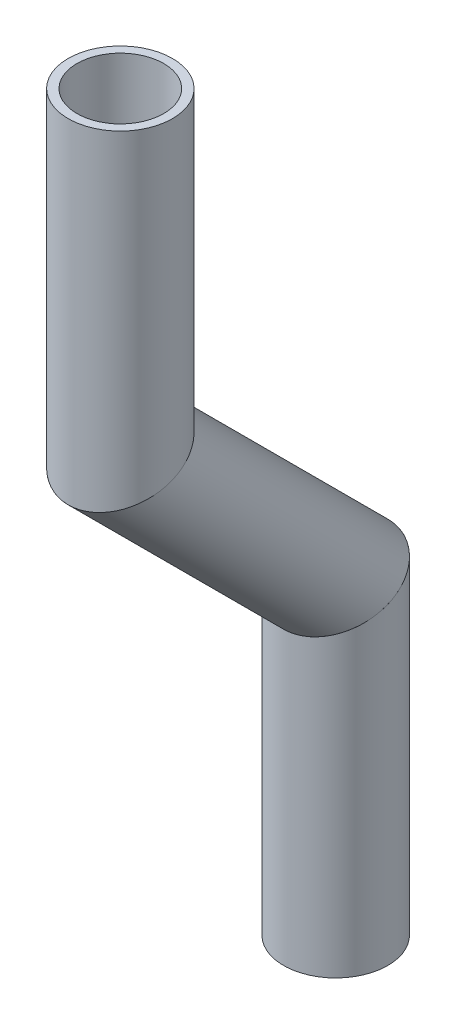
ISO-10303-21;
HEADER;
FILE_DESCRIPTION(('STEP AP214'),'2;1');
FILE_NAME('part.step','',(''),(''),'','','');
FILE_SCHEMA(('AUTOMOTIVE_DESIGN { 1 0 10303 214 1 1 1 1 }'));
ENDSEC;
DATA;
#1=APPLICATION_CONTEXT('core data for automotive mechanical design processes');
#2=APPLICATION_PROTOCOL_DEFINITION('international standard','automotive_design',2000,#1);
#3=PRODUCT_CONTEXT('',#1,'mechanical');
#4=PRODUCT('Part','Part','',(#3));
#5=PRODUCT_RELATED_PRODUCT_CATEGORY('part','',(#4));
#6=PRODUCT_DEFINITION_FORMATION('','',#4);
#7=PRODUCT_DEFINITION_CONTEXT('part definition',#1,'design');
#8=PRODUCT_DEFINITION('design','',#6,#7);
#9=PRODUCT_DEFINITION_SHAPE('','',#8);
#10=(LENGTH_UNIT() NAMED_UNIT(*) SI_UNIT(.MILLI.,.METRE.));
#11=(NAMED_UNIT(*) PLANE_ANGLE_UNIT() SI_UNIT($,.RADIAN.));
#12=(NAMED_UNIT(*) SI_UNIT($,.STERADIAN.) SOLID_ANGLE_UNIT());
#13=UNCERTAINTY_MEASURE_WITH_UNIT(LENGTH_MEASURE(1.E-05),#10,'distance_accuracy_value','');
#14=(GEOMETRIC_REPRESENTATION_CONTEXT(3) GLOBAL_UNCERTAINTY_ASSIGNED_CONTEXT((#13)) GLOBAL_UNIT_ASSIGNED_CONTEXT((#10,
#11,#12)) REPRESENTATION_CONTEXT('',''));
#15=CARTESIAN_POINT('',(0.,0.,0.));
#16=DIRECTION('',(0.,0.,1.));
#17=DIRECTION('',(1.,0.,0.));
#18=AXIS2_PLACEMENT_3D('',#15,#16,#17);
#19=CARTESIAN_POINT('',(0.,-248.701594492154,300.531279363213));
#20=DIRECTION('',(0.,1.,0.));
#21=DIRECTION('',(0.,0.,1.));
#22=AXIS2_PLACEMENT_3D('',#19,#20,#21);
#23=CYLINDRICAL_SURFACE('',#22,5.28319999999999);
#24=CARTESIAN_POINT('',(0.,-210.601594492154,300.531279363213));
#25=DIRECTION('',(0.,-1.,0.));
#26=DIRECTION('',(0.,0.,-1.));
#27=AXIS2_PLACEMENT_3D('',#24,#25,#26);
#28=CIRCLE('',#27,5.28319999999999);
#29=CARTESIAN_POINT('',(0.,-210.601594492154,295.248079363213));
#30=VERTEX_POINT('',#29);
#31=EDGE_CURVE('E55',#30,#30,#28,.T.);
#32=ORIENTED_EDGE('',*,*,#31,.F.);
#33=EDGE_LOOP('',(#32));
#34=FACE_BOUND('',#33,.T.);
#35=CARTESIAN_POINT('',(0.,-248.701594492154,300.531279363213));
#36=DIRECTION('',(0.,-0.923879532511285,-0.382683432365094));
#37=DIRECTION('',(0.,0.382683432365094,-0.923879532511285));
#38=AXIS2_PLACEMENT_3D('',#35,#36,#37);
#39=ELLIPSE('',#38,5.71849447258477,5.28319999999999);
#40=CARTESIAN_POINT('',(0.,-246.513221399424,295.248079363213));
#41=VERTEX_POINT('',#40);
#42=EDGE_CURVE('E51',#41,#41,#39,.T.);
#43=ORIENTED_EDGE('',*,*,#42,.T.);
#44=EDGE_LOOP('',(#43));
#45=FACE_BOUND('',#44,.T.);
#46=ADVANCED_FACE('F47',(#34,#45),#23,.F.);
#47=CARTESIAN_POINT('',(0.,-248.701594492154,300.531279363213));
#48=DIRECTION('',(0.,1.,0.));
#49=DIRECTION('',(0.,0.,1.));
#50=AXIS2_PLACEMENT_3D('',#47,#48,#49);
#51=CYLINDRICAL_SURFACE('',#50,6.35);
#52=CARTESIAN_POINT('',(0.,-210.601594492154,300.531279363213));
#53=DIRECTION('',(0.,-1.,0.));
#54=DIRECTION('',(0.,0.,-1.));
#55=AXIS2_PLACEMENT_3D('',#52,#53,#54);
#56=CIRCLE('',#55,6.35);
#57=CARTESIAN_POINT('',(0.,-210.601594492154,294.181279363213));
#58=VERTEX_POINT('',#57);
#59=EDGE_CURVE('E59',#58,#58,#56,.T.);
#60=ORIENTED_EDGE('',*,*,#59,.T.);
#61=EDGE_LOOP('',(#60));
#62=FACE_BOUND('',#61,.T.);
#63=CARTESIAN_POINT('',(0.,-248.701594492154,300.531279363213));
#64=DIRECTION('',(0.,-0.923879532511285,-0.382683432365094));
#65=DIRECTION('',(0.,0.382683432365094,-0.923879532511285));
#66=AXIS2_PLACEMENT_3D('',#63,#64,#65);
#67=ELLIPSE('',#66,6.87319047185671,6.35);
#68=CARTESIAN_POINT('',(0.,-246.071338371085,294.181279363213));
#69=VERTEX_POINT('',#68);
#70=EDGE_CURVE('E12',#69,#69,#67,.T.);
#71=ORIENTED_EDGE('',*,*,#70,.F.);
#72=EDGE_LOOP('',(#71));
#73=FACE_BOUND('',#72,.T.);
#74=ADVANCED_FACE('F74',(#62,#73),#51,.T.);
#75=CARTESIAN_POINT('',(0.,-210.601594492154,300.531279363213));
#76=DIRECTION('',(0.,-1.,0.));
#77=DIRECTION('',(0.,0.,-1.));
#78=AXIS2_PLACEMENT_3D('',#75,#76,#77);
#79=PLANE('',#78);
#80=ORIENTED_EDGE('',*,*,#31,.T.);
#81=EDGE_LOOP('',(#80));
#82=FACE_BOUND('',#81,.T.);
#83=ORIENTED_EDGE('',*,*,#59,.F.);
#84=EDGE_LOOP('',(#83));
#85=FACE_BOUND('',#84,.T.);
#86=ADVANCED_FACE('F70',(#82,#85),#79,.F.);
#87=CARTESIAN_POINT('',(0.,-248.701594492154,300.531279363213));
#88=DIRECTION('',(0.,-0.923879532511285,-0.382683432365094));
#89=DIRECTION('',(0.,0.382683432365094,-0.923879532511285));
#90=AXIS2_PLACEMENT_3D('',#87,#88,#89);
#91=PLANE('',#90);
#92=ORIENTED_EDGE('',*,*,#42,.F.);
#93=EDGE_LOOP('',(#92));
#94=FACE_BOUND('',#93,.T.);
#95=ORIENTED_EDGE('',*,*,#70,.T.);
#96=EDGE_LOOP('',(#95));
#97=FACE_BOUND('',#96,.T.);
#98=ADVANCED_FACE('F49',(#94,#97),#91,.T.);
#99=CLOSED_SHELL('',(#46,#74,#86,#98));
#100=MANIFOLD_SOLID_BREP('B2',#99);
#101=CARTESIAN_POINT('',(0.,-274.928148458393,274.304725396973));
#102=DIRECTION('',(0.,0.707106781186541,0.707106781186554));
#103=DIRECTION('',(0.,-0.707106781186554,0.707106781186541));
#104=AXIS2_PLACEMENT_3D('',#101,#102,#103);
#105=CYLINDRICAL_SURFACE('',#104,5.28319999999999);
#106=CARTESIAN_POINT('',(0.,-274.928148458393,274.304725396973));
#107=DIRECTION('',(0.,-0.923879532511285,-0.382683432365094));
#108=DIRECTION('',(0.,-0.382683432365094,0.923879532511285));
#109=AXIS2_PLACEMENT_3D('',#106,#107,#108);
#110=ELLIPSE('',#109,5.71849447258477,5.28319999999999);
#111=CARTESIAN_POINT('',(0.,-277.116521551122,279.587925396973));
#112=VERTEX_POINT('',#111);
#113=EDGE_CURVE('E150',#112,#112,#110,.T.);
#114=ORIENTED_EDGE('',*,*,#113,.T.);
#115=EDGE_LOOP('',(#114));
#116=FACE_BOUND('',#115,.T.);
#117=CARTESIAN_POINT('',(0.,-248.701594492154,300.531279363213));
#118=DIRECTION('',(0.,0.923879532511285,0.382683432365094));
#119=DIRECTION('',(0.,-0.382683432365094,0.923879532511285));
#120=AXIS2_PLACEMENT_3D('',#117,#118,#119);
#121=ELLIPSE('',#120,5.71849447258477,5.28319999999999);
#122=CARTESIAN_POINT('',(0.,-250.889967584883,305.814479363213));
#123=VERTEX_POINT('',#122);
#124=EDGE_CURVE('E140',#123,#123,#121,.T.);
#125=ORIENTED_EDGE('',*,*,#124,.T.);
#126=EDGE_LOOP('',(#125));
#127=FACE_BOUND('',#126,.T.);
#128=ADVANCED_FACE('F136',(#116,#127),#105,.F.);
#129=CARTESIAN_POINT('',(0.,-274.928148458393,274.304725396973));
#130=DIRECTION('',(0.,0.707106781186541,0.707106781186554));
#131=DIRECTION('',(0.,-0.707106781186554,0.707106781186541));
#132=AXIS2_PLACEMENT_3D('',#129,#130,#131);
#133=CYLINDRICAL_SURFACE('',#132,6.35);
#134=CARTESIAN_POINT('',(0.,-274.928148458393,274.304725396973));
#135=DIRECTION('',(0.,-0.923879532511285,-0.382683432365094));
#136=DIRECTION('',(0.,-0.382683432365094,0.923879532511285));
#137=AXIS2_PLACEMENT_3D('',#134,#135,#136);
#138=ELLIPSE('',#137,6.87319047185671,6.35);
#139=CARTESIAN_POINT('',(0.,-277.558404579462,280.654725396973));
#140=VERTEX_POINT('',#139);
#141=EDGE_CURVE('E144',#140,#140,#138,.T.);
#142=ORIENTED_EDGE('',*,*,#141,.F.);
#143=EDGE_LOOP('',(#142));
#144=FACE_BOUND('',#143,.T.);
#145=CARTESIAN_POINT('',(0.,-248.701594492154,300.531279363213));
#146=DIRECTION('',(0.,0.923879532511285,0.382683432365094));
#147=DIRECTION('',(0.,-0.382683432365094,0.923879532511285));
#148=AXIS2_PLACEMENT_3D('',#145,#146,#147);
#149=ELLIPSE('',#148,6.87319047185671,6.35);
#150=CARTESIAN_POINT('',(0.,-251.331850613223,306.881279363213));
#151=VERTEX_POINT('',#150);
#152=EDGE_CURVE('E46',#151,#151,#149,.T.);
#153=ORIENTED_EDGE('',*,*,#152,.F.);
#154=EDGE_LOOP('',(#153));
#155=FACE_BOUND('',#154,.T.);
#156=ADVANCED_FACE('F163',(#144,#155),#133,.T.);
#157=CARTESIAN_POINT('',(0.,-274.928148458393,274.304725396973));
#158=DIRECTION('',(0.,-0.923879532511285,-0.382683432365094));
#159=DIRECTION('',(0.,0.382683432365094,-0.923879532511285));
#160=AXIS2_PLACEMENT_3D('',#157,#158,#159);
#161=PLANE('',#160);
#162=ORIENTED_EDGE('',*,*,#113,.F.);
#163=EDGE_LOOP('',(#162));
#164=FACE_BOUND('',#163,.T.);
#165=ORIENTED_EDGE('',*,*,#141,.T.);
#166=EDGE_LOOP('',(#165));
#167=FACE_BOUND('',#166,.T.);
#168=ADVANCED_FACE('F159',(#164,#167),#161,.T.);
#169=CARTESIAN_POINT('',(0.,-248.701594492154,300.531279363213));
#170=DIRECTION('',(0.,0.923879532511285,0.382683432365094));
#171=DIRECTION('',(0.,-0.382683432365094,0.923879532511285));
#172=AXIS2_PLACEMENT_3D('',#169,#170,#171);
#173=PLANE('',#172);
#174=ORIENTED_EDGE('',*,*,#124,.F.);
#175=EDGE_LOOP('',(#174));
#176=FACE_BOUND('',#175,.T.);
#177=ORIENTED_EDGE('',*,*,#152,.T.);
#178=EDGE_LOOP('',(#177));
#179=FACE_BOUND('',#178,.T.);
#180=ADVANCED_FACE('F138',(#176,#179),#173,.T.);
#181=CLOSED_SHELL('',(#128,#156,#168,#180));
#182=MANIFOLD_SOLID_BREP('B7',#181);
#183=CARTESIAN_POINT('',(0.,-313.028148458393,274.304725396973));
#184=DIRECTION('',(0.,1.,0.));
#185=DIRECTION('',(0.,0.,1.));
#186=AXIS2_PLACEMENT_3D('',#183,#184,#185);
#187=CYLINDRICAL_SURFACE('',#186,5.28319999999999);
#188=CARTESIAN_POINT('',(0.,-313.028148458393,274.304725396973));
#189=DIRECTION('',(0.,-1.,0.));
#190=DIRECTION('',(0.,0.,-1.));
#191=AXIS2_PLACEMENT_3D('',#188,#189,#190);
#192=CIRCLE('',#191,5.28319999999999);
#193=CARTESIAN_POINT('',(0.,-313.028148458393,269.021525396973));
#194=VERTEX_POINT('',#193);
#195=EDGE_CURVE('E234',#194,#194,#192,.T.);
#196=ORIENTED_EDGE('',*,*,#195,.T.);
#197=EDGE_LOOP('',(#196));
#198=FACE_BOUND('',#197,.T.);
#199=CARTESIAN_POINT('',(0.,-274.928148458393,274.304725396973));
#200=DIRECTION('',(0.,0.923879532511285,0.382683432365094));
#201=DIRECTION('',(0.,0.382683432365094,-0.923879532511285));
#202=AXIS2_PLACEMENT_3D('',#199,#200,#201);
#203=ELLIPSE('',#202,5.71849447258477,5.28319999999999);
#204=CARTESIAN_POINT('',(0.,-272.739775365663,269.021525396973));
#205=VERTEX_POINT('',#204);
#206=EDGE_CURVE('E224',#205,#205,#203,.T.);
#207=ORIENTED_EDGE('',*,*,#206,.T.);
#208=EDGE_LOOP('',(#207));
#209=FACE_BOUND('',#208,.T.);
#210=ADVANCED_FACE('F220',(#198,#209),#187,.F.);
#211=CARTESIAN_POINT('',(0.,-313.028148458393,274.304725396973));
#212=DIRECTION('',(0.,1.,0.));
#213=DIRECTION('',(0.,0.,1.));
#214=AXIS2_PLACEMENT_3D('',#211,#212,#213);
#215=CYLINDRICAL_SURFACE('',#214,6.35);
#216=CARTESIAN_POINT('',(0.,-313.028148458393,274.304725396973));
#217=DIRECTION('',(0.,-1.,0.));
#218=DIRECTION('',(0.,0.,-1.));
#219=AXIS2_PLACEMENT_3D('',#216,#217,#218);
#220=CIRCLE('',#219,6.35);
#221=CARTESIAN_POINT('',(0.,-313.028148458393,267.954725396973));
#222=VERTEX_POINT('',#221);
#223=EDGE_CURVE('E228',#222,#222,#220,.T.);
#224=ORIENTED_EDGE('',*,*,#223,.F.);
#225=EDGE_LOOP('',(#224));
#226=FACE_BOUND('',#225,.T.);
#227=CARTESIAN_POINT('',(0.,-274.928148458393,274.304725396973));
#228=DIRECTION('',(0.,0.923879532511285,0.382683432365094));
#229=DIRECTION('',(0.,0.382683432365094,-0.923879532511285));
#230=AXIS2_PLACEMENT_3D('',#227,#228,#229);
#231=ELLIPSE('',#230,6.87319047185671,6.35);
#232=CARTESIAN_POINT('',(0.,-272.297892337324,267.954725396973));
#233=VERTEX_POINT('',#232);
#234=EDGE_CURVE('E135',#233,#233,#231,.T.);
#235=ORIENTED_EDGE('',*,*,#234,.F.);
#236=EDGE_LOOP('',(#235));
#237=FACE_BOUND('',#236,.T.);
#238=ADVANCED_FACE('F247',(#226,#237),#215,.T.);
#239=CARTESIAN_POINT('',(0.,-313.028148458393,274.304725396973));
#240=DIRECTION('',(0.,-1.,0.));
#241=DIRECTION('',(0.,0.,-1.));
#242=AXIS2_PLACEMENT_3D('',#239,#240,#241);
#243=PLANE('',#242);
#244=ORIENTED_EDGE('',*,*,#195,.F.);
#245=EDGE_LOOP('',(#244));
#246=FACE_BOUND('',#245,.T.);
#247=ORIENTED_EDGE('',*,*,#223,.T.);
#248=EDGE_LOOP('',(#247));
#249=FACE_BOUND('',#248,.T.);
#250=ADVANCED_FACE('F243',(#246,#249),#243,.T.);
#251=CARTESIAN_POINT('',(0.,-274.928148458393,274.304725396973));
#252=DIRECTION('',(0.,0.923879532511285,0.382683432365094));
#253=DIRECTION('',(0.,-0.382683432365094,0.923879532511285));
#254=AXIS2_PLACEMENT_3D('',#251,#252,#253);
#255=PLANE('',#254);
#256=ORIENTED_EDGE('',*,*,#206,.F.);
#257=EDGE_LOOP('',(#256));
#258=FACE_BOUND('',#257,.T.);
#259=ORIENTED_EDGE('',*,*,#234,.T.);
#260=EDGE_LOOP('',(#259));
#261=FACE_BOUND('',#260,.T.);
#262=ADVANCED_FACE('F222',(#258,#261),#255,.T.);
#263=CLOSED_SHELL('',(#210,#238,#250,#262));
#264=MANIFOLD_SOLID_BREP('B41',#263);
#265=ADVANCED_BREP_SHAPE_REPRESENTATION('',(#18,#100,#182,#264),#14);
#266=SHAPE_DEFINITION_REPRESENTATION(#9,#265);
ENDSEC;
END-ISO-10303-21;
